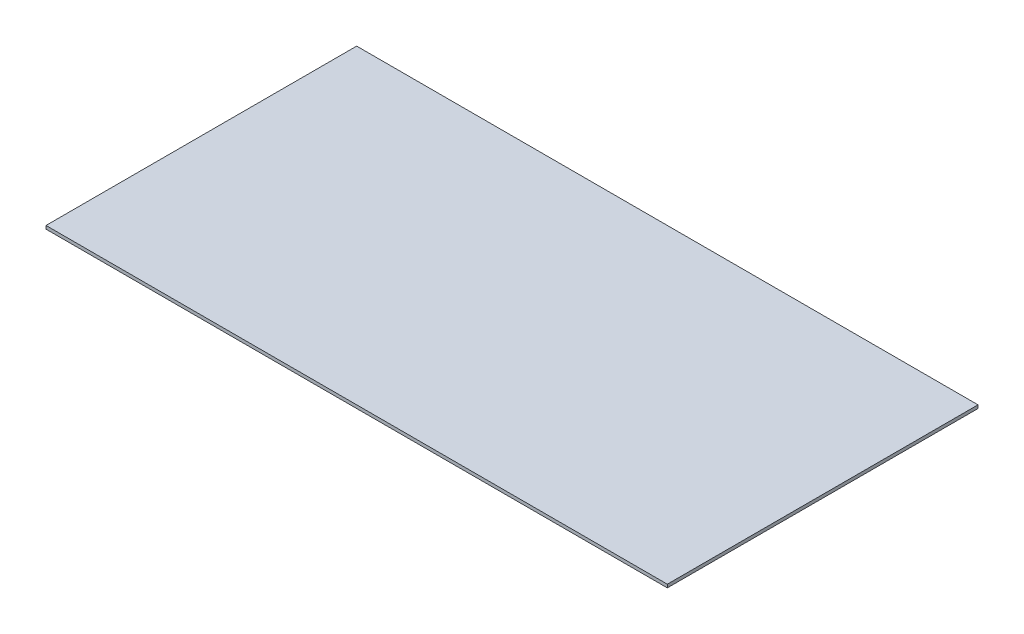
ISO-10303-21;
HEADER;
FILE_DESCRIPTION(('STEP AP214'),'2;1');
FILE_NAME('part.step','',(''),(''),'','','');
FILE_SCHEMA(('AUTOMOTIVE_DESIGN { 1 0 10303 214 1 1 1 1 }'));
ENDSEC;
DATA;
#1=APPLICATION_CONTEXT('core data for automotive mechanical design processes');
#2=APPLICATION_PROTOCOL_DEFINITION('international standard','automotive_design',2000,#1);
#3=PRODUCT_CONTEXT('',#1,'mechanical');
#4=PRODUCT('Part','Part','',(#3));
#5=PRODUCT_RELATED_PRODUCT_CATEGORY('part','',(#4));
#6=PRODUCT_DEFINITION_FORMATION('','',#4);
#7=PRODUCT_DEFINITION_CONTEXT('part definition',#1,'design');
#8=PRODUCT_DEFINITION('design','',#6,#7);
#9=PRODUCT_DEFINITION_SHAPE('','',#8);
#10=(LENGTH_UNIT() NAMED_UNIT(*) SI_UNIT(.MILLI.,.METRE.));
#11=(NAMED_UNIT(*) PLANE_ANGLE_UNIT() SI_UNIT($,.RADIAN.));
#12=(NAMED_UNIT(*) SI_UNIT($,.STERADIAN.) SOLID_ANGLE_UNIT());
#13=UNCERTAINTY_MEASURE_WITH_UNIT(LENGTH_MEASURE(1.E-05),#10,'distance_accuracy_value','');
#14=(GEOMETRIC_REPRESENTATION_CONTEXT(3) GLOBAL_UNCERTAINTY_ASSIGNED_CONTEXT((#13)) GLOBAL_UNIT_ASSIGNED_CONTEXT((#10,
#11,#12)) REPRESENTATION_CONTEXT('',''));
#15=CARTESIAN_POINT('',(0.,0.,0.));
#16=DIRECTION('',(0.,0.,1.));
#17=DIRECTION('',(1.,0.,0.));
#18=AXIS2_PLACEMENT_3D('',#15,#16,#17);
#19=CARTESIAN_POINT('',(0.,0.,-304.8));
#20=DIRECTION('',(-1.,0.,0.));
#21=DIRECTION('',(0.,0.,1.));
#22=AXIS2_PLACEMENT_3D('',#19,#20,#21);
#23=PLANE('',#22);
#24=DIRECTION('',(0.,-1.,0.));
#25=VECTOR('',#24,1.);
#26=CARTESIAN_POINT('',(0.,0.,0.));
#27=LINE('',#26,#25);
#28=CARTESIAN_POINT('',(0.,3.175,0.));
#29=VERTEX_POINT('',#28);
#30=CARTESIAN_POINT('',(0.,0.,0.));
#31=VERTEX_POINT('',#30);
#32=EDGE_CURVE('E112',#29,#31,#27,.T.);
#33=ORIENTED_EDGE('',*,*,#32,.F.);
#34=DIRECTION('',(0.,0.,1.));
#35=VECTOR('',#34,1.);
#36=CARTESIAN_POINT('',(0.,3.175,-304.8));
#37=LINE('',#36,#35);
#38=CARTESIAN_POINT('',(0.,3.175,-304.8));
#39=VERTEX_POINT('',#38);
#40=EDGE_CURVE('E11',#39,#29,#37,.T.);
#41=ORIENTED_EDGE('',*,*,#40,.F.);
#42=DIRECTION('',(0.,-1.,0.));
#43=VECTOR('',#42,1.);
#44=CARTESIAN_POINT('',(0.,0.,-304.8));
#45=LINE('',#44,#43);
#46=CARTESIAN_POINT('',(0.,0.,-304.8));
#47=VERTEX_POINT('',#46);
#48=EDGE_CURVE('E103',#39,#47,#45,.T.);
#49=ORIENTED_EDGE('',*,*,#48,.T.);
#50=DIRECTION('',(0.,0.,1.));
#51=VECTOR('',#50,1.);
#52=CARTESIAN_POINT('',(0.,0.,-304.8));
#53=LINE('',#52,#51);
#54=EDGE_CURVE('E44',#47,#31,#53,.T.);
#55=ORIENTED_EDGE('',*,*,#54,.T.);
#56=EDGE_LOOP('',(#33,#41,#49,#55));
#57=FACE_BOUND('',#56,.T.);
#58=ADVANCED_FACE('F41',(#57),#23,.T.);
#59=CARTESIAN_POINT('',(0.,3.175,-304.8));
#60=DIRECTION('',(0.,1.,0.));
#61=DIRECTION('',(0.,0.,1.));
#62=AXIS2_PLACEMENT_3D('',#59,#60,#61);
#63=PLANE('',#62);
#64=DIRECTION('',(-1.,0.,0.));
#65=VECTOR('',#64,1.);
#66=CARTESIAN_POINT('',(0.,3.175,0.));
#67=LINE('',#66,#65);
#68=CARTESIAN_POINT('',(609.6,3.175,0.));
#69=VERTEX_POINT('',#68);
#70=EDGE_CURVE('E107',#69,#29,#67,.T.);
#71=ORIENTED_EDGE('',*,*,#70,.F.);
#72=DIRECTION('',(0.,0.,1.));
#73=VECTOR('',#72,1.);
#74=CARTESIAN_POINT('',(609.6,3.175,-304.8));
#75=LINE('',#74,#73);
#76=CARTESIAN_POINT('',(609.6,3.175,-304.8));
#77=VERTEX_POINT('',#76);
#78=EDGE_CURVE('E51',#77,#69,#75,.T.);
#79=ORIENTED_EDGE('',*,*,#78,.F.);
#80=DIRECTION('',(-1.,0.,0.));
#81=VECTOR('',#80,1.);
#82=CARTESIAN_POINT('',(0.,3.175,-304.8));
#83=LINE('',#82,#81);
#84=EDGE_CURVE('E98',#77,#39,#83,.T.);
#85=ORIENTED_EDGE('',*,*,#84,.T.);
#86=ORIENTED_EDGE('',*,*,#40,.T.);
#87=EDGE_LOOP('',(#71,#79,#85,#86));
#88=FACE_BOUND('',#87,.T.);
#89=ADVANCED_FACE('F134',(#88),#63,.T.);
#90=CARTESIAN_POINT('',(609.6,0.,-304.8));
#91=DIRECTION('',(1.,0.,0.));
#92=DIRECTION('',(0.,0.,-1.));
#93=AXIS2_PLACEMENT_3D('',#90,#91,#92);
#94=PLANE('',#93);
#95=DIRECTION('',(0.,1.,0.));
#96=VECTOR('',#95,1.);
#97=CARTESIAN_POINT('',(609.6,0.,0.));
#98=LINE('',#97,#96);
#99=CARTESIAN_POINT('',(609.6,0.,0.));
#100=VERTEX_POINT('',#99);
#101=EDGE_CURVE('E92',#100,#69,#98,.T.);
#102=ORIENTED_EDGE('',*,*,#101,.F.);
#103=DIRECTION('',(0.,0.,1.));
#104=VECTOR('',#103,1.);
#105=CARTESIAN_POINT('',(609.6,0.,-304.8));
#106=LINE('',#105,#104);
#107=CARTESIAN_POINT('',(609.6,0.,-304.8));
#108=VERTEX_POINT('',#107);
#109=EDGE_CURVE('E87',#108,#100,#106,.T.);
#110=ORIENTED_EDGE('',*,*,#109,.F.);
#111=DIRECTION('',(0.,1.,0.));
#112=VECTOR('',#111,1.);
#113=CARTESIAN_POINT('',(609.6,0.,-304.8));
#114=LINE('',#113,#112);
#115=EDGE_CURVE('E90',#108,#77,#114,.T.);
#116=ORIENTED_EDGE('',*,*,#115,.T.);
#117=ORIENTED_EDGE('',*,*,#78,.T.);
#118=EDGE_LOOP('',(#102,#110,#116,#117));
#119=FACE_BOUND('',#118,.T.);
#120=ADVANCED_FACE('F89',(#119),#94,.T.);
#121=CARTESIAN_POINT('',(0.,0.,-304.8));
#122=DIRECTION('',(0.,-1.,0.));
#123=DIRECTION('',(0.,0.,-1.));
#124=AXIS2_PLACEMENT_3D('',#121,#122,#123);
#125=PLANE('',#124);
#126=DIRECTION('',(1.,0.,0.));
#127=VECTOR('',#126,1.);
#128=CARTESIAN_POINT('',(0.,0.,0.));
#129=LINE('',#128,#127);
#130=EDGE_CURVE('E116',#31,#100,#129,.T.);
#131=ORIENTED_EDGE('',*,*,#130,.F.);
#132=ORIENTED_EDGE('',*,*,#54,.F.);
#133=DIRECTION('',(1.,0.,0.));
#134=VECTOR('',#133,1.);
#135=CARTESIAN_POINT('',(0.,0.,-304.8));
#136=LINE('',#135,#134);
#137=EDGE_CURVE('E97',#47,#108,#136,.T.);
#138=ORIENTED_EDGE('',*,*,#137,.T.);
#139=ORIENTED_EDGE('',*,*,#109,.T.);
#140=EDGE_LOOP('',(#131,#132,#138,#139));
#141=FACE_BOUND('',#140,.T.);
#142=ADVANCED_FACE('F101',(#141),#125,.T.);
#143=CARTESIAN_POINT('',(0.,0.,-304.8));
#144=DIRECTION('',(0.,0.,-1.));
#145=DIRECTION('',(-1.,0.,0.));
#146=AXIS2_PLACEMENT_3D('',#143,#144,#145);
#147=PLANE('',#146);
#148=ORIENTED_EDGE('',*,*,#48,.F.);
#149=ORIENTED_EDGE('',*,*,#84,.F.);
#150=ORIENTED_EDGE('',*,*,#115,.F.);
#151=ORIENTED_EDGE('',*,*,#137,.F.);
#152=EDGE_LOOP('',(#148,#149,#150,#151));
#153=FACE_BOUND('',#152,.T.);
#154=ADVANCED_FACE('F96',(#153),#147,.T.);
#155=CARTESIAN_POINT('',(0.,0.,0.));
#156=DIRECTION('',(0.,0.,-1.));
#157=DIRECTION('',(-1.,0.,0.));
#158=AXIS2_PLACEMENT_3D('',#155,#156,#157);
#159=PLANE('',#158);
#160=ORIENTED_EDGE('',*,*,#32,.T.);
#161=ORIENTED_EDGE('',*,*,#130,.T.);
#162=ORIENTED_EDGE('',*,*,#101,.T.);
#163=ORIENTED_EDGE('',*,*,#70,.T.);
#164=EDGE_LOOP('',(#160,#161,#162,#163));
#165=FACE_BOUND('',#164,.T.);
#166=ADVANCED_FACE('F133',(#165),#159,.F.);
#167=CLOSED_SHELL('',(#58,#89,#120,#142,#154,#166));
#168=MANIFOLD_SOLID_BREP('B2',#167);
#169=ADVANCED_BREP_SHAPE_REPRESENTATION('',(#18,#168),#14);
#170=SHAPE_DEFINITION_REPRESENTATION(#9,#169);
ENDSEC;
END-ISO-10303-21;
